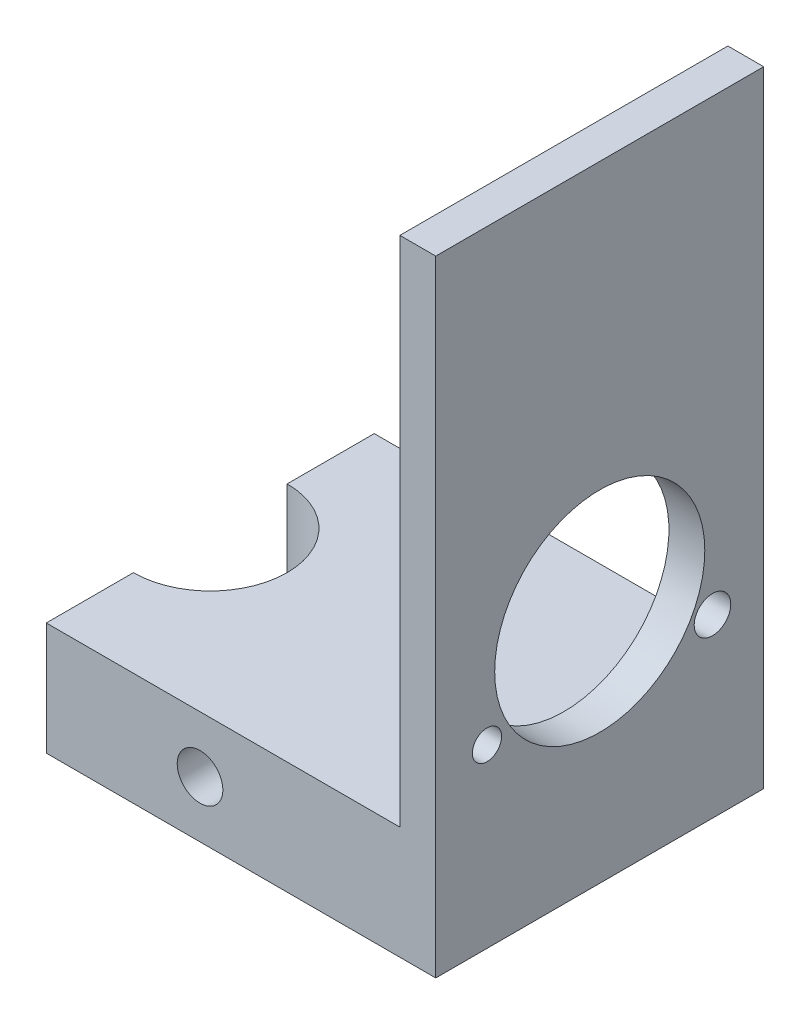
ISO-10303-21;
HEADER;
FILE_DESCRIPTION(('STEP AP214'),'2;1');
FILE_NAME('part.step','',(''),(''),'','','');
FILE_SCHEMA(('AUTOMOTIVE_DESIGN { 1 0 10303 214 1 1 1 1 }'));
ENDSEC;
DATA;
#1=APPLICATION_CONTEXT('core data for automotive mechanical design processes');
#2=APPLICATION_PROTOCOL_DEFINITION('international standard','automotive_design',2000,#1);
#3=PRODUCT_CONTEXT('',#1,'mechanical');
#4=PRODUCT('Part','Part','',(#3));
#5=PRODUCT_RELATED_PRODUCT_CATEGORY('part','',(#4));
#6=PRODUCT_DEFINITION_FORMATION('','',#4);
#7=PRODUCT_DEFINITION_CONTEXT('part definition',#1,'design');
#8=PRODUCT_DEFINITION('design','',#6,#7);
#9=PRODUCT_DEFINITION_SHAPE('','',#8);
#10=(LENGTH_UNIT() NAMED_UNIT(*) SI_UNIT(.MILLI.,.METRE.));
#11=(NAMED_UNIT(*) PLANE_ANGLE_UNIT() SI_UNIT($,.RADIAN.));
#12=(NAMED_UNIT(*) SI_UNIT($,.STERADIAN.) SOLID_ANGLE_UNIT());
#13=UNCERTAINTY_MEASURE_WITH_UNIT(LENGTH_MEASURE(1.E-05),#10,'distance_accuracy_value','');
#14=(GEOMETRIC_REPRESENTATION_CONTEXT(3) GLOBAL_UNCERTAINTY_ASSIGNED_CONTEXT((#13)) GLOBAL_UNIT_ASSIGNED_CONTEXT((#10,
#11,#12)) REPRESENTATION_CONTEXT('',''));
#15=CARTESIAN_POINT('',(0.,0.,0.));
#16=DIRECTION('',(0.,0.,1.));
#17=DIRECTION('',(1.,0.,0.));
#18=AXIS2_PLACEMENT_3D('',#15,#16,#17);
#19=CARTESIAN_POINT('',(0.,11.,0.));
#20=DIRECTION('',(0.,-1.,0.));
#21=DIRECTION('',(0.,0.,-1.));
#22=AXIS2_PLACEMENT_3D('',#19,#20,#21);
#23=CYLINDRICAL_SURFACE('',#22,7.5);
#24=CARTESIAN_POINT('',(0.,0.,0.));
#25=DIRECTION('',(0.,1.,0.));
#26=DIRECTION('',(0.,0.,1.));
#27=AXIS2_PLACEMENT_3D('',#24,#25,#26);
#28=CIRCLE('',#27,7.5);
#29=CARTESIAN_POINT('',(0.,0.,7.5));
#30=VERTEX_POINT('',#29);
#31=CARTESIAN_POINT('',(0.,0.,-7.5));
#32=VERTEX_POINT('',#31);
#33=EDGE_CURVE('E142',#30,#32,#28,.T.);
#34=ORIENTED_EDGE('',*,*,#33,.F.);
#35=DIRECTION('',(0.,-1.,0.));
#36=VECTOR('',#35,1.);
#37=CARTESIAN_POINT('',(0.,11.,7.5));
#38=LINE('',#37,#36);
#39=CARTESIAN_POINT('',(0.,11.,7.5));
#40=VERTEX_POINT('',#39);
#41=EDGE_CURVE('E11',#40,#30,#38,.T.);
#42=ORIENTED_EDGE('',*,*,#41,.F.);
#43=CARTESIAN_POINT('',(0.,11.,0.));
#44=DIRECTION('',(0.,1.,0.));
#45=DIRECTION('',(0.,0.,1.));
#46=AXIS2_PLACEMENT_3D('',#43,#44,#45);
#47=CIRCLE('',#46,7.5);
#48=CARTESIAN_POINT('',(0.,11.,-7.5));
#49=VERTEX_POINT('',#48);
#50=EDGE_CURVE('E143',#40,#49,#47,.T.);
#51=ORIENTED_EDGE('',*,*,#50,.T.);
#52=DIRECTION('',(0.,-1.,0.));
#53=VECTOR('',#52,1.);
#54=CARTESIAN_POINT('',(0.,11.,-7.5));
#55=LINE('',#54,#53);
#56=EDGE_CURVE('E82',#49,#32,#55,.T.);
#57=ORIENTED_EDGE('',*,*,#56,.T.);
#58=EDGE_LOOP('',(#34,#42,#51,#57));
#59=FACE_BOUND('',#58,.T.);
#60=ADVANCED_FACE('F34',(#59),#23,.F.);
#61=CARTESIAN_POINT('',(0.,11.,0.));
#62=DIRECTION('',(1.,0.,0.));
#63=DIRECTION('',(0.,0.,-1.));
#64=AXIS2_PLACEMENT_3D('',#61,#62,#63);
#65=PLANE('',#64);
#66=DIRECTION('',(0.,0.,1.));
#67=VECTOR('',#66,1.);
#68=CARTESIAN_POINT('',(0.,0.,0.));
#69=LINE('',#68,#67);
#70=CARTESIAN_POINT('',(0.,0.,16.));
#71=VERTEX_POINT('',#70);
#72=EDGE_CURVE('E154',#30,#71,#69,.T.);
#73=ORIENTED_EDGE('',*,*,#72,.T.);
#74=DIRECTION('',(0.,-1.,0.));
#75=VECTOR('',#74,1.);
#76=CARTESIAN_POINT('',(0.,11.,16.));
#77=LINE('',#76,#75);
#78=CARTESIAN_POINT('',(0.,11.,16.));
#79=VERTEX_POINT('',#78);
#80=EDGE_CURVE('E41',#79,#71,#77,.T.);
#81=ORIENTED_EDGE('',*,*,#80,.F.);
#82=DIRECTION('',(0.,0.,1.));
#83=VECTOR('',#82,1.);
#84=CARTESIAN_POINT('',(0.,11.,0.));
#85=LINE('',#84,#83);
#86=EDGE_CURVE('E145',#40,#79,#85,.T.);
#87=ORIENTED_EDGE('',*,*,#86,.F.);
#88=ORIENTED_EDGE('',*,*,#41,.T.);
#89=EDGE_LOOP('',(#73,#81,#87,#88));
#90=FACE_BOUND('',#89,.T.);
#91=ADVANCED_FACE('F187',(#90),#65,.F.);
#92=CARTESIAN_POINT('',(0.,11.,16.));
#93=DIRECTION('',(0.,0.,-1.));
#94=DIRECTION('',(-1.,0.,0.));
#95=AXIS2_PLACEMENT_3D('',#92,#93,#94);
#96=PLANE('',#95);
#97=CARTESIAN_POINT('',(15.,5.5,16.));
#98=DIRECTION('',(0.,0.,-1.));
#99=DIRECTION('',(-1.,0.,0.));
#100=AXIS2_PLACEMENT_3D('',#97,#98,#99);
#101=CIRCLE('',#100,2.22645949007591);
#102=CARTESIAN_POINT('',(12.7735405099241,5.5,16.));
#103=VERTEX_POINT('',#102);
#104=EDGE_CURVE('E225',#103,#103,#101,.T.);
#105=ORIENTED_EDGE('',*,*,#104,.T.);
#106=EDGE_LOOP('',(#105));
#107=FACE_BOUND('',#106,.T.);
#108=DIRECTION('',(1.,0.,0.));
#109=VECTOR('',#108,1.);
#110=CARTESIAN_POINT('',(0.,0.,16.));
#111=LINE('',#110,#109);
#112=CARTESIAN_POINT('',(38.,0.,16.));
#113=VERTEX_POINT('',#112);
#114=EDGE_CURVE('E156',#71,#113,#111,.T.);
#115=ORIENTED_EDGE('',*,*,#114,.T.);
#116=DIRECTION('',(0.,-1.,0.));
#117=VECTOR('',#116,1.);
#118=CARTESIAN_POINT('',(38.,11.,16.));
#119=LINE('',#118,#117);
#120=CARTESIAN_POINT('',(38.,61.,16.));
#121=VERTEX_POINT('',#120);
#122=EDGE_CURVE('E114',#121,#113,#119,.T.);
#123=ORIENTED_EDGE('',*,*,#122,.F.);
#124=DIRECTION('',(1.,0.,0.));
#125=VECTOR('',#124,1.);
#126=CARTESIAN_POINT('',(38.,61.,16.));
#127=LINE('',#126,#125);
#128=CARTESIAN_POINT('',(34.5,61.,16.));
#129=VERTEX_POINT('',#128);
#130=EDGE_CURVE('E129',#129,#121,#127,.T.);
#131=ORIENTED_EDGE('',*,*,#130,.F.);
#132=DIRECTION('',(0.,-1.,0.));
#133=VECTOR('',#132,1.);
#134=CARTESIAN_POINT('',(34.5,61.,16.));
#135=LINE('',#134,#133);
#136=CARTESIAN_POINT('',(34.5,11.,16.));
#137=VERTEX_POINT('',#136);
#138=EDGE_CURVE('E137',#129,#137,#135,.T.);
#139=ORIENTED_EDGE('',*,*,#138,.T.);
#140=DIRECTION('',(1.,0.,0.));
#141=VECTOR('',#140,1.);
#142=CARTESIAN_POINT('',(0.,11.,16.));
#143=LINE('',#142,#141);
#144=EDGE_CURVE('E148',#79,#137,#143,.T.);
#145=ORIENTED_EDGE('',*,*,#144,.F.);
#146=ORIENTED_EDGE('',*,*,#80,.T.);
#147=EDGE_LOOP('',(#115,#123,#131,#139,#145,#146));
#148=FACE_BOUND('',#147,.T.);
#149=ADVANCED_FACE('F169',(#107,#148),#96,.F.);
#150=CARTESIAN_POINT('',(38.,11.,0.));
#151=DIRECTION('',(1.,0.,0.));
#152=DIRECTION('',(0.,0.,-1.));
#153=AXIS2_PLACEMENT_3D('',#150,#151,#152);
#154=PLANE('',#153);
#155=CARTESIAN_POINT('',(38.,17.2028115427221,11.));
#156=DIRECTION('',(1.,0.,0.));
#157=DIRECTION('',(0.,0.,-1.));
#158=AXIS2_PLACEMENT_3D('',#155,#156,#157);
#159=CIRCLE('',#158,1.42619686923485);
#160=CARTESIAN_POINT('',(38.,17.2028115427221,9.57380313076514));
#161=VERTEX_POINT('',#160);
#162=EDGE_CURVE('E131',#161,#161,#159,.T.);
#163=ORIENTED_EDGE('',*,*,#162,.F.);
#164=EDGE_LOOP('',(#163));
#165=FACE_BOUND('',#164,.T.);
#166=CARTESIAN_POINT('',(38.,17.2028115427221,-11.));
#167=DIRECTION('',(1.,0.,0.));
#168=DIRECTION('',(0.,0.,-1.));
#169=AXIS2_PLACEMENT_3D('',#166,#167,#168);
#170=CIRCLE('',#169,1.78360949148613);
#171=CARTESIAN_POINT('',(38.,17.2028115427221,-12.7836094914861));
#172=VERTEX_POINT('',#171);
#173=EDGE_CURVE('E211',#172,#172,#170,.T.);
#174=ORIENTED_EDGE('',*,*,#173,.F.);
#175=EDGE_LOOP('',(#174));
#176=FACE_BOUND('',#175,.T.);
#177=CARTESIAN_POINT('',(38.,23.,0.));
#178=DIRECTION('',(1.,0.,0.));
#179=DIRECTION('',(0.,0.,-1.));
#180=AXIS2_PLACEMENT_3D('',#177,#178,#179);
#181=CIRCLE('',#180,10.25);
#182=CARTESIAN_POINT('',(38.,23.,-10.25));
#183=VERTEX_POINT('',#182);
#184=EDGE_CURVE('E214',#183,#183,#181,.T.);
#185=ORIENTED_EDGE('',*,*,#184,.F.);
#186=EDGE_LOOP('',(#185));
#187=FACE_BOUND('',#186,.T.);
#188=DIRECTION('',(0.,0.,1.));
#189=VECTOR('',#188,1.);
#190=CARTESIAN_POINT('',(38.,0.,0.));
#191=LINE('',#190,#189);
#192=CARTESIAN_POINT('',(38.,0.,-16.));
#193=VERTEX_POINT('',#192);
#194=EDGE_CURVE('E110',#193,#113,#191,.T.);
#195=ORIENTED_EDGE('',*,*,#194,.F.);
#196=DIRECTION('',(0.,-1.,0.));
#197=VECTOR('',#196,1.);
#198=CARTESIAN_POINT('',(38.,11.,-16.));
#199=LINE('',#198,#197);
#200=CARTESIAN_POINT('',(38.,61.,-16.));
#201=VERTEX_POINT('',#200);
#202=EDGE_CURVE('E104',#201,#193,#199,.T.);
#203=ORIENTED_EDGE('',*,*,#202,.F.);
#204=DIRECTION('',(0.,0.,-1.));
#205=VECTOR('',#204,1.);
#206=CARTESIAN_POINT('',(38.,61.,-16.));
#207=LINE('',#206,#205);
#208=EDGE_CURVE('E108',#121,#201,#207,.T.);
#209=ORIENTED_EDGE('',*,*,#208,.F.);
#210=ORIENTED_EDGE('',*,*,#122,.T.);
#211=EDGE_LOOP('',(#195,#203,#209,#210));
#212=FACE_BOUND('',#211,.T.);
#213=ADVANCED_FACE('F106',(#165,#176,#187,#212),#154,.T.);
#214=CARTESIAN_POINT('',(0.,11.,-16.));
#215=DIRECTION('',(0.,0.,-1.));
#216=DIRECTION('',(-1.,0.,0.));
#217=AXIS2_PLACEMENT_3D('',#214,#215,#216);
#218=PLANE('',#217);
#219=CARTESIAN_POINT('',(15.,5.5,-16.));
#220=DIRECTION('',(0.,0.,-1.));
#221=DIRECTION('',(-1.,0.,0.));
#222=AXIS2_PLACEMENT_3D('',#219,#220,#221);
#223=CIRCLE('',#222,2.22645949007591);
#224=CARTESIAN_POINT('',(12.7735405099241,5.5,-16.));
#225=VERTEX_POINT('',#224);
#226=EDGE_CURVE('E230',#225,#225,#223,.T.);
#227=ORIENTED_EDGE('',*,*,#226,.F.);
#228=EDGE_LOOP('',(#227));
#229=FACE_BOUND('',#228,.T.);
#230=DIRECTION('',(1.,0.,0.));
#231=VECTOR('',#230,1.);
#232=CARTESIAN_POINT('',(0.,0.,-16.));
#233=LINE('',#232,#231);
#234=CARTESIAN_POINT('',(0.,0.,-16.));
#235=VERTEX_POINT('',#234);
#236=EDGE_CURVE('E160',#235,#193,#233,.T.);
#237=ORIENTED_EDGE('',*,*,#236,.F.);
#238=DIRECTION('',(0.,-1.,0.));
#239=VECTOR('',#238,1.);
#240=CARTESIAN_POINT('',(0.,11.,-16.));
#241=LINE('',#240,#239);
#242=CARTESIAN_POINT('',(0.,11.,-16.));
#243=VERTEX_POINT('',#242);
#244=EDGE_CURVE('E115',#243,#235,#241,.T.);
#245=ORIENTED_EDGE('',*,*,#244,.F.);
#246=DIRECTION('',(1.,0.,0.));
#247=VECTOR('',#246,1.);
#248=CARTESIAN_POINT('',(0.,11.,-16.));
#249=LINE('',#248,#247);
#250=CARTESIAN_POINT('',(34.5,11.,-16.));
#251=VERTEX_POINT('',#250);
#252=EDGE_CURVE('E150',#243,#251,#249,.T.);
#253=ORIENTED_EDGE('',*,*,#252,.T.);
#254=DIRECTION('',(0.,-1.,0.));
#255=VECTOR('',#254,1.);
#256=CARTESIAN_POINT('',(34.5,61.,-16.));
#257=LINE('',#256,#255);
#258=CARTESIAN_POINT('',(34.5,61.,-16.));
#259=VERTEX_POINT('',#258);
#260=EDGE_CURVE('E121',#259,#251,#257,.T.);
#261=ORIENTED_EDGE('',*,*,#260,.F.);
#262=DIRECTION('',(-1.,0.,0.));
#263=VECTOR('',#262,1.);
#264=CARTESIAN_POINT('',(38.,61.,-16.));
#265=LINE('',#264,#263);
#266=EDGE_CURVE('E118',#201,#259,#265,.T.);
#267=ORIENTED_EDGE('',*,*,#266,.F.);
#268=ORIENTED_EDGE('',*,*,#202,.T.);
#269=EDGE_LOOP('',(#237,#245,#253,#261,#267,#268));
#270=FACE_BOUND('',#269,.T.);
#271=ADVANCED_FACE('F119',(#229,#270),#218,.T.);
#272=EDGE_CURVE('E146',#235,#32,#69,.T.);
#273=ORIENTED_EDGE('',*,*,#272,.T.);
#274=ORIENTED_EDGE('',*,*,#56,.F.);
#275=EDGE_CURVE('E55',#243,#49,#85,.T.);
#276=ORIENTED_EDGE('',*,*,#275,.F.);
#277=ORIENTED_EDGE('',*,*,#244,.T.);
#278=EDGE_LOOP('',(#273,#274,#276,#277));
#279=FACE_BOUND('',#278,.T.);
#280=ADVANCED_FACE('F176',(#279),#65,.F.);
#281=CARTESIAN_POINT('',(0.,11.,0.));
#282=DIRECTION('',(0.,1.,0.));
#283=DIRECTION('',(0.,0.,1.));
#284=AXIS2_PLACEMENT_3D('',#281,#282,#283);
#285=PLANE('',#284);
#286=DIRECTION('',(0.,0.,1.));
#287=VECTOR('',#286,1.);
#288=CARTESIAN_POINT('',(34.5,11.,-16.));
#289=LINE('',#288,#287);
#290=EDGE_CURVE('E48',#251,#137,#289,.T.);
#291=ORIENTED_EDGE('',*,*,#290,.F.);
#292=ORIENTED_EDGE('',*,*,#252,.F.);
#293=ORIENTED_EDGE('',*,*,#275,.T.);
#294=ORIENTED_EDGE('',*,*,#50,.F.);
#295=ORIENTED_EDGE('',*,*,#86,.T.);
#296=ORIENTED_EDGE('',*,*,#144,.T.);
#297=EDGE_LOOP('',(#291,#292,#293,#294,#295,#296));
#298=FACE_BOUND('',#297,.T.);
#299=ADVANCED_FACE('F177',(#298),#285,.T.);
#300=CARTESIAN_POINT('',(0.,0.,0.));
#301=DIRECTION('',(0.,1.,0.));
#302=DIRECTION('',(0.,0.,1.));
#303=AXIS2_PLACEMENT_3D('',#300,#301,#302);
#304=PLANE('',#303);
#305=ORIENTED_EDGE('',*,*,#33,.T.);
#306=ORIENTED_EDGE('',*,*,#272,.F.);
#307=ORIENTED_EDGE('',*,*,#236,.T.);
#308=ORIENTED_EDGE('',*,*,#194,.T.);
#309=ORIENTED_EDGE('',*,*,#114,.F.);
#310=ORIENTED_EDGE('',*,*,#72,.F.);
#311=EDGE_LOOP('',(#305,#306,#307,#308,#309,#310));
#312=FACE_BOUND('',#311,.T.);
#313=ADVANCED_FACE('F173',(#312),#304,.F.);
#314=CARTESIAN_POINT('',(34.5,61.,-16.));
#315=DIRECTION('',(1.,0.,0.));
#316=DIRECTION('',(0.,0.,-1.));
#317=AXIS2_PLACEMENT_3D('',#314,#315,#316);
#318=PLANE('',#317);
#319=CARTESIAN_POINT('',(34.5,17.2028115427221,11.));
#320=DIRECTION('',(-1.,0.,0.));
#321=DIRECTION('',(0.,0.,1.));
#322=AXIS2_PLACEMENT_3D('',#319,#320,#321);
#323=CIRCLE('',#322,1.42619686923485);
#324=CARTESIAN_POINT('',(34.5,17.2028115427221,12.4261968692348));
#325=VERTEX_POINT('',#324);
#326=EDGE_CURVE('E222',#325,#325,#323,.T.);
#327=ORIENTED_EDGE('',*,*,#326,.F.);
#328=EDGE_LOOP('',(#327));
#329=FACE_BOUND('',#328,.T.);
#330=CARTESIAN_POINT('',(34.5,17.2028115427221,-11.));
#331=DIRECTION('',(-1.,0.,0.));
#332=DIRECTION('',(0.,0.,1.));
#333=AXIS2_PLACEMENT_3D('',#330,#331,#332);
#334=CIRCLE('',#333,1.78360949148613);
#335=CARTESIAN_POINT('',(34.5,17.2028115427221,-9.21639050851388));
#336=VERTEX_POINT('',#335);
#337=EDGE_CURVE('E219',#336,#336,#334,.T.);
#338=ORIENTED_EDGE('',*,*,#337,.F.);
#339=EDGE_LOOP('',(#338));
#340=FACE_BOUND('',#339,.T.);
#341=CARTESIAN_POINT('',(34.5,23.,0.));
#342=DIRECTION('',(-1.,0.,0.));
#343=DIRECTION('',(0.,0.,1.));
#344=AXIS2_PLACEMENT_3D('',#341,#342,#343);
#345=CIRCLE('',#344,10.25);
#346=CARTESIAN_POINT('',(34.5,23.,10.25));
#347=VERTEX_POINT('',#346);
#348=EDGE_CURVE('E216',#347,#347,#345,.T.);
#349=ORIENTED_EDGE('',*,*,#348,.F.);
#350=EDGE_LOOP('',(#349));
#351=FACE_BOUND('',#350,.T.);
#352=ORIENTED_EDGE('',*,*,#290,.T.);
#353=ORIENTED_EDGE('',*,*,#138,.F.);
#354=DIRECTION('',(0.,0.,1.));
#355=VECTOR('',#354,1.);
#356=CARTESIAN_POINT('',(34.5,61.,-16.));
#357=LINE('',#356,#355);
#358=EDGE_CURVE('E124',#259,#129,#357,.T.);
#359=ORIENTED_EDGE('',*,*,#358,.F.);
#360=ORIENTED_EDGE('',*,*,#260,.T.);
#361=EDGE_LOOP('',(#352,#353,#359,#360));
#362=FACE_BOUND('',#361,.T.);
#363=ADVANCED_FACE('F184',(#329,#340,#351,#362),#318,.F.);
#364=CARTESIAN_POINT('',(0.,61.,0.));
#365=DIRECTION('',(0.,-1.,0.));
#366=DIRECTION('',(0.,0.,-1.));
#367=AXIS2_PLACEMENT_3D('',#364,#365,#366);
#368=PLANE('',#367);
#369=ORIENTED_EDGE('',*,*,#208,.T.);
#370=ORIENTED_EDGE('',*,*,#266,.T.);
#371=ORIENTED_EDGE('',*,*,#358,.T.);
#372=ORIENTED_EDGE('',*,*,#130,.T.);
#373=EDGE_LOOP('',(#369,#370,#371,#372));
#374=FACE_BOUND('',#373,.T.);
#375=ADVANCED_FACE('F127',(#374),#368,.F.);
#376=CARTESIAN_POINT('',(84.5,23.,0.));
#377=DIRECTION('',(-1.,0.,0.));
#378=DIRECTION('',(0.,0.,1.));
#379=AXIS2_PLACEMENT_3D('',#376,#377,#378);
#380=CYLINDRICAL_SURFACE('',#379,10.25);
#381=ORIENTED_EDGE('',*,*,#184,.T.);
#382=EDGE_LOOP('',(#381));
#383=FACE_BOUND('',#382,.T.);
#384=ORIENTED_EDGE('',*,*,#348,.T.);
#385=EDGE_LOOP('',(#384));
#386=FACE_BOUND('',#385,.T.);
#387=ADVANCED_FACE('F248',(#383,#386),#380,.F.);
#388=CARTESIAN_POINT('',(84.5,17.2028115427221,-11.));
#389=DIRECTION('',(-1.,0.,0.));
#390=DIRECTION('',(0.,0.,1.));
#391=AXIS2_PLACEMENT_3D('',#388,#389,#390);
#392=CYLINDRICAL_SURFACE('',#391,1.78360949148613);
#393=ORIENTED_EDGE('',*,*,#173,.T.);
#394=EDGE_LOOP('',(#393));
#395=FACE_BOUND('',#394,.T.);
#396=ORIENTED_EDGE('',*,*,#337,.T.);
#397=EDGE_LOOP('',(#396));
#398=FACE_BOUND('',#397,.T.);
#399=ADVANCED_FACE('F243',(#395,#398),#392,.F.);
#400=CARTESIAN_POINT('',(84.5,17.2028115427221,11.));
#401=DIRECTION('',(-1.,0.,0.));
#402=DIRECTION('',(0.,0.,1.));
#403=AXIS2_PLACEMENT_3D('',#400,#401,#402);
#404=CYLINDRICAL_SURFACE('',#403,1.42619686923485);
#405=ORIENTED_EDGE('',*,*,#162,.T.);
#406=EDGE_LOOP('',(#405));
#407=FACE_BOUND('',#406,.T.);
#408=ORIENTED_EDGE('',*,*,#326,.T.);
#409=EDGE_LOOP('',(#408));
#410=FACE_BOUND('',#409,.T.);
#411=ADVANCED_FACE('F237',(#407,#410),#404,.F.);
#412=CARTESIAN_POINT('',(15.,5.5,20.));
#413=DIRECTION('',(0.,0.,-1.));
#414=DIRECTION('',(-1.,0.,0.));
#415=AXIS2_PLACEMENT_3D('',#412,#413,#414);
#416=CYLINDRICAL_SURFACE('',#415,2.22645949007591);
#417=ORIENTED_EDGE('',*,*,#226,.T.);
#418=EDGE_LOOP('',(#417));
#419=FACE_BOUND('',#418,.T.);
#420=ORIENTED_EDGE('',*,*,#104,.F.);
#421=EDGE_LOOP('',(#420));
#422=FACE_BOUND('',#421,.T.);
#423=ADVANCED_FACE('F234',(#419,#422),#416,.F.);
#424=CLOSED_SHELL('',(#60,#91,#149,#213,#271,#280,#299,#313,#363,#375,#387,#399,#411,#423));
#425=MANIFOLD_SOLID_BREP('B2',#424);
#426=ADVANCED_BREP_SHAPE_REPRESENTATION('',(#18,#425),#14);
#427=SHAPE_DEFINITION_REPRESENTATION(#9,#426);
ENDSEC;
END-ISO-10303-21;
